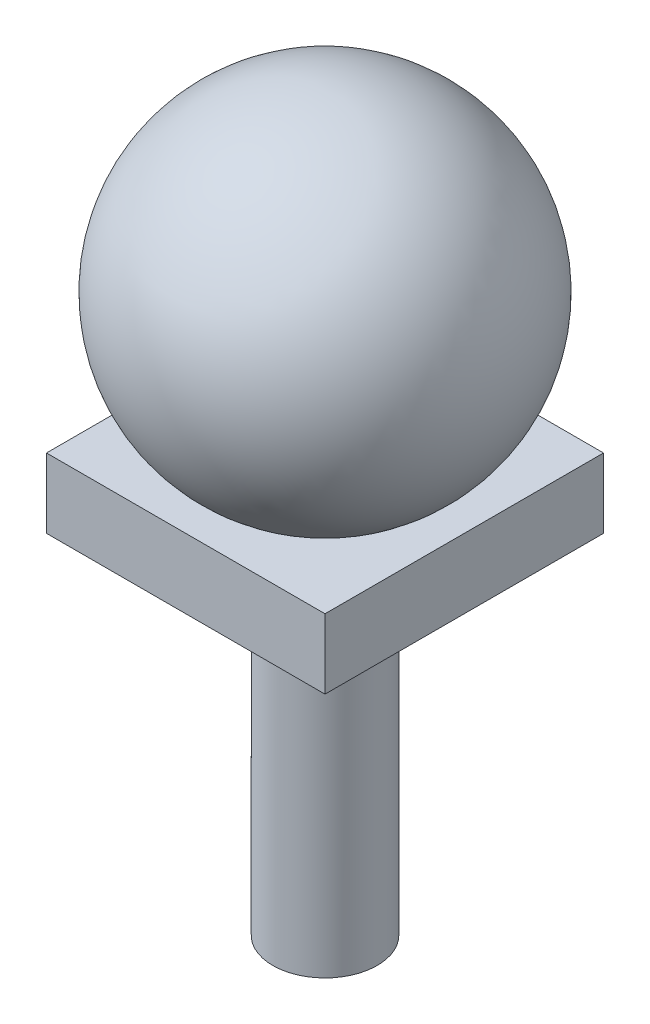
ISO-10303-21;
HEADER;
FILE_DESCRIPTION(('STEP AP214'),'2;1');
FILE_NAME('part.step','',(''),(''),'','','');
FILE_SCHEMA(('AUTOMOTIVE_DESIGN { 1 0 10303 214 1 1 1 1 }'));
ENDSEC;
DATA;
#1=APPLICATION_CONTEXT('core data for automotive mechanical design processes');
#2=APPLICATION_PROTOCOL_DEFINITION('international standard','automotive_design',2000,#1);
#3=PRODUCT_CONTEXT('',#1,'mechanical');
#4=PRODUCT('Part','Part','',(#3));
#5=PRODUCT_RELATED_PRODUCT_CATEGORY('part','',(#4));
#6=PRODUCT_DEFINITION_FORMATION('','',#4);
#7=PRODUCT_DEFINITION_CONTEXT('part definition',#1,'design');
#8=PRODUCT_DEFINITION('design','',#6,#7);
#9=PRODUCT_DEFINITION_SHAPE('','',#8);
#10=(LENGTH_UNIT() NAMED_UNIT(*) SI_UNIT(.MILLI.,.METRE.));
#11=(NAMED_UNIT(*) PLANE_ANGLE_UNIT() SI_UNIT($,.RADIAN.));
#12=(NAMED_UNIT(*) SI_UNIT($,.STERADIAN.) SOLID_ANGLE_UNIT());
#13=UNCERTAINTY_MEASURE_WITH_UNIT(LENGTH_MEASURE(1.E-05),#10,'distance_accuracy_value','');
#14=(GEOMETRIC_REPRESENTATION_CONTEXT(3) GLOBAL_UNCERTAINTY_ASSIGNED_CONTEXT((#13)) GLOBAL_UNIT_ASSIGNED_CONTEXT((#10,
#11,#12)) REPRESENTATION_CONTEXT('',''));
#15=CARTESIAN_POINT('',(0.,0.,0.));
#16=DIRECTION('',(0.,0.,1.));
#17=DIRECTION('',(1.,0.,0.));
#18=AXIS2_PLACEMENT_3D('',#15,#16,#17);
#19=CARTESIAN_POINT('',(0.,5.,0.));
#20=DIRECTION('',(0.,1.,0.));
#21=DIRECTION('',(-1.,0.,0.));
#22=AXIS2_PLACEMENT_3D('',#19,#20,#21);
#23=CYLINDRICAL_SURFACE('',#22,1.5);
#24=CARTESIAN_POINT('',(0.,-6.,0.));
#25=DIRECTION('',(0.,-1.,0.));
#26=DIRECTION('',(1.,0.,0.));
#27=AXIS2_PLACEMENT_3D('',#24,#25,#26);
#28=CIRCLE('',#27,1.5);
#29=CARTESIAN_POINT('',(1.5,-6.,0.));
#30=VERTEX_POINT('',#29);
#31=EDGE_CURVE('E38',#30,#30,#28,.T.);
#32=ORIENTED_EDGE('',*,*,#31,.T.);
#33=EDGE_LOOP('',(#32));
#34=FACE_BOUND('',#33,.T.);
#35=CARTESIAN_POINT('',(0.,-16.,0.));
#36=DIRECTION('',(0.,1.,0.));
#37=DIRECTION('',(-1.,0.,0.));
#38=AXIS2_PLACEMENT_3D('',#35,#36,#37);
#39=CIRCLE('',#38,1.5);
#40=CARTESIAN_POINT('',(-1.5,-16.,0.));
#41=VERTEX_POINT('',#40);
#42=EDGE_CURVE('E44',#41,#41,#39,.T.);
#43=ORIENTED_EDGE('',*,*,#42,.T.);
#44=EDGE_LOOP('',(#43));
#45=FACE_BOUND('',#44,.T.);
#46=ADVANCED_FACE('F35',(#34,#45),#23,.T.);
#47=CARTESIAN_POINT('',(0.,-16.,0.));
#48=DIRECTION('',(0.,1.,0.));
#49=DIRECTION('',(-1.,0.,0.));
#50=AXIS2_PLACEMENT_3D('',#47,#48,#49);
#51=PLANE('',#50);
#52=ORIENTED_EDGE('',*,*,#42,.F.);
#53=EDGE_LOOP('',(#52));
#54=FACE_BOUND('',#53,.T.);
#55=ADVANCED_FACE('F135',(#54),#51,.F.);
#56=CARTESIAN_POINT('',(4.,-4.,4.));
#57=DIRECTION('',(1.,0.,0.));
#58=DIRECTION('',(0.,1.,0.));
#59=AXIS2_PLACEMENT_3D('',#56,#57,#58);
#60=PLANE('',#59);
#61=DIRECTION('',(0.,0.,1.));
#62=VECTOR('',#61,1.);
#63=CARTESIAN_POINT('',(4.,-6.,4.));
#64=LINE('',#63,#62);
#65=CARTESIAN_POINT('',(4.,-6.,-4.));
#66=VERTEX_POINT('',#65);
#67=CARTESIAN_POINT('',(4.,-6.,4.));
#68=VERTEX_POINT('',#67);
#69=EDGE_CURVE('E103',#66,#68,#64,.T.);
#70=ORIENTED_EDGE('',*,*,#69,.F.);
#71=DIRECTION('',(0.,-1.,0.));
#72=VECTOR('',#71,1.);
#73=CARTESIAN_POINT('',(4.,-4.,-4.));
#74=LINE('',#73,#72);
#75=CARTESIAN_POINT('',(4.,-4.,-4.));
#76=VERTEX_POINT('',#75);
#77=EDGE_CURVE('E52',#76,#66,#74,.T.);
#78=ORIENTED_EDGE('',*,*,#77,.F.);
#79=DIRECTION('',(0.,0.,1.));
#80=VECTOR('',#79,1.);
#81=CARTESIAN_POINT('',(4.,-4.,4.));
#82=LINE('',#81,#80);
#83=CARTESIAN_POINT('',(4.,-4.,4.));
#84=VERTEX_POINT('',#83);
#85=EDGE_CURVE('E97',#76,#84,#82,.T.);
#86=ORIENTED_EDGE('',*,*,#85,.T.);
#87=DIRECTION('',(0.,-1.,0.));
#88=VECTOR('',#87,1.);
#89=CARTESIAN_POINT('',(4.,-4.,4.));
#90=LINE('',#89,#88);
#91=EDGE_CURVE('E80',#84,#68,#90,.T.);
#92=ORIENTED_EDGE('',*,*,#91,.T.);
#93=EDGE_LOOP('',(#70,#78,#86,#92));
#94=FACE_BOUND('',#93,.T.);
#95=ADVANCED_FACE('F126',(#94),#60,.T.);
#96=CARTESIAN_POINT('',(-4.,-4.,-4.));
#97=DIRECTION('',(0.,0.,-1.));
#98=DIRECTION('',(-1.,0.,0.));
#99=AXIS2_PLACEMENT_3D('',#96,#97,#98);
#100=PLANE('',#99);
#101=DIRECTION('',(1.,0.,0.));
#102=VECTOR('',#101,1.);
#103=CARTESIAN_POINT('',(-4.,-6.,-4.));
#104=LINE('',#103,#102);
#105=CARTESIAN_POINT('',(-4.,-6.,-4.));
#106=VERTEX_POINT('',#105);
#107=EDGE_CURVE('E99',#106,#66,#104,.T.);
#108=ORIENTED_EDGE('',*,*,#107,.F.);
#109=DIRECTION('',(0.,-1.,0.));
#110=VECTOR('',#109,1.);
#111=CARTESIAN_POINT('',(-4.,-4.,-4.));
#112=LINE('',#111,#110);
#113=CARTESIAN_POINT('',(-4.,-4.,-4.));
#114=VERTEX_POINT('',#113);
#115=EDGE_CURVE('E69',#114,#106,#112,.T.);
#116=ORIENTED_EDGE('',*,*,#115,.F.);
#117=DIRECTION('',(1.,0.,0.));
#118=VECTOR('',#117,1.);
#119=CARTESIAN_POINT('',(-4.,-4.,-4.));
#120=LINE('',#119,#118);
#121=EDGE_CURVE('E94',#114,#76,#120,.T.);
#122=ORIENTED_EDGE('',*,*,#121,.T.);
#123=ORIENTED_EDGE('',*,*,#77,.T.);
#124=EDGE_LOOP('',(#108,#116,#122,#123));
#125=FACE_BOUND('',#124,.T.);
#126=ADVANCED_FACE('F127',(#125),#100,.T.);
#127=CARTESIAN_POINT('',(-4.,-4.,4.));
#128=DIRECTION('',(-1.,0.,0.));
#129=DIRECTION('',(0.,-1.,0.));
#130=AXIS2_PLACEMENT_3D('',#127,#128,#129);
#131=PLANE('',#130);
#132=DIRECTION('',(0.,0.,-1.));
#133=VECTOR('',#132,1.);
#134=CARTESIAN_POINT('',(-4.,-6.,4.));
#135=LINE('',#134,#133);
#136=CARTESIAN_POINT('',(-4.,-6.,4.));
#137=VERTEX_POINT('',#136);
#138=EDGE_CURVE('E88',#137,#106,#135,.T.);
#139=ORIENTED_EDGE('',*,*,#138,.F.);
#140=DIRECTION('',(0.,-1.,0.));
#141=VECTOR('',#140,1.);
#142=CARTESIAN_POINT('',(-4.,-4.,4.));
#143=LINE('',#142,#141);
#144=CARTESIAN_POINT('',(-4.,-4.,4.));
#145=VERTEX_POINT('',#144);
#146=EDGE_CURVE('E83',#145,#137,#143,.T.);
#147=ORIENTED_EDGE('',*,*,#146,.F.);
#148=DIRECTION('',(0.,0.,-1.));
#149=VECTOR('',#148,1.);
#150=CARTESIAN_POINT('',(-4.,-4.,4.));
#151=LINE('',#150,#149);
#152=EDGE_CURVE('E86',#145,#114,#151,.T.);
#153=ORIENTED_EDGE('',*,*,#152,.T.);
#154=ORIENTED_EDGE('',*,*,#115,.T.);
#155=EDGE_LOOP('',(#139,#147,#153,#154));
#156=FACE_BOUND('',#155,.T.);
#157=ADVANCED_FACE('F85',(#156),#131,.T.);
#158=CARTESIAN_POINT('',(-4.,-4.,4.));
#159=DIRECTION('',(0.,0.,1.));
#160=DIRECTION('',(1.,0.,0.));
#161=AXIS2_PLACEMENT_3D('',#158,#159,#160);
#162=PLANE('',#161);
#163=DIRECTION('',(-1.,0.,0.));
#164=VECTOR('',#163,1.);
#165=CARTESIAN_POINT('',(-4.,-6.,4.));
#166=LINE('',#165,#164);
#167=EDGE_CURVE('E106',#68,#137,#166,.T.);
#168=ORIENTED_EDGE('',*,*,#167,.F.);
#169=ORIENTED_EDGE('',*,*,#91,.F.);
#170=DIRECTION('',(-1.,0.,0.));
#171=VECTOR('',#170,1.);
#172=CARTESIAN_POINT('',(-4.,-4.,4.));
#173=LINE('',#172,#171);
#174=EDGE_CURVE('E93',#84,#145,#173,.T.);
#175=ORIENTED_EDGE('',*,*,#174,.T.);
#176=ORIENTED_EDGE('',*,*,#146,.T.);
#177=EDGE_LOOP('',(#168,#169,#175,#176));
#178=FACE_BOUND('',#177,.T.);
#179=ADVANCED_FACE('F96',(#178),#162,.T.);
#180=CARTESIAN_POINT('',(0.,-4.,0.));
#181=DIRECTION('',(0.,-1.,0.));
#182=DIRECTION('',(1.,0.,0.));
#183=AXIS2_PLACEMENT_3D('',#180,#181,#182);
#184=PLANE('',#183);
#185=CARTESIAN_POINT('',(0.,-4.,0.));
#186=DIRECTION('',(0.,-1.,0.));
#187=DIRECTION('',(1.,0.,0.));
#188=AXIS2_PLACEMENT_3D('',#185,#186,#187);
#189=CIRCLE('',#188,3.);
#190=CARTESIAN_POINT('',(3.,-4.,0.));
#191=VERTEX_POINT('',#190);
#192=EDGE_CURVE('E11',#191,#191,#189,.T.);
#193=ORIENTED_EDGE('',*,*,#192,.T.);
#194=EDGE_LOOP('',(#193));
#195=FACE_BOUND('',#194,.T.);
#196=ORIENTED_EDGE('',*,*,#85,.F.);
#197=ORIENTED_EDGE('',*,*,#121,.F.);
#198=ORIENTED_EDGE('',*,*,#152,.F.);
#199=ORIENTED_EDGE('',*,*,#174,.F.);
#200=EDGE_LOOP('',(#196,#197,#198,#199));
#201=FACE_BOUND('',#200,.T.);
#202=ADVANCED_FACE('F92',(#195,#201),#184,.F.);
#203=CARTESIAN_POINT('',(0.,-6.,0.));
#204=DIRECTION('',(0.,-1.,0.));
#205=DIRECTION('',(1.,0.,0.));
#206=AXIS2_PLACEMENT_3D('',#203,#204,#205);
#207=PLANE('',#206);
#208=ORIENTED_EDGE('',*,*,#31,.F.);
#209=EDGE_LOOP('',(#208));
#210=FACE_BOUND('',#209,.T.);
#211=ORIENTED_EDGE('',*,*,#69,.T.);
#212=ORIENTED_EDGE('',*,*,#167,.T.);
#213=ORIENTED_EDGE('',*,*,#138,.T.);
#214=ORIENTED_EDGE('',*,*,#107,.T.);
#215=EDGE_LOOP('',(#211,#212,#213,#214));
#216=FACE_BOUND('',#215,.T.);
#217=ADVANCED_FACE('F121',(#210,#216),#207,.T.);
#218=CARTESIAN_POINT('',(0.,0.,0.));
#219=DIRECTION('',(0.,1.,0.));
#220=DIRECTION('',(-1.,0.,0.));
#221=AXIS2_PLACEMENT_3D('',#218,#219,#220);
#222=SPHERICAL_SURFACE('',#221,5.);
#223=ORIENTED_EDGE('',*,*,#192,.F.);
#224=EDGE_LOOP('',(#223));
#225=FACE_BOUND('',#224,.T.);
#226=ADVANCED_FACE('F124',(#225),#222,.T.);
#227=CLOSED_SHELL('',(#46,#55,#95,#126,#157,#179,#202,#217,#226));
#228=MANIFOLD_SOLID_BREP('B2',#227);
#229=ADVANCED_BREP_SHAPE_REPRESENTATION('',(#18,#228),#14);
#230=SHAPE_DEFINITION_REPRESENTATION(#9,#229);
ENDSEC;
END-ISO-10303-21;
